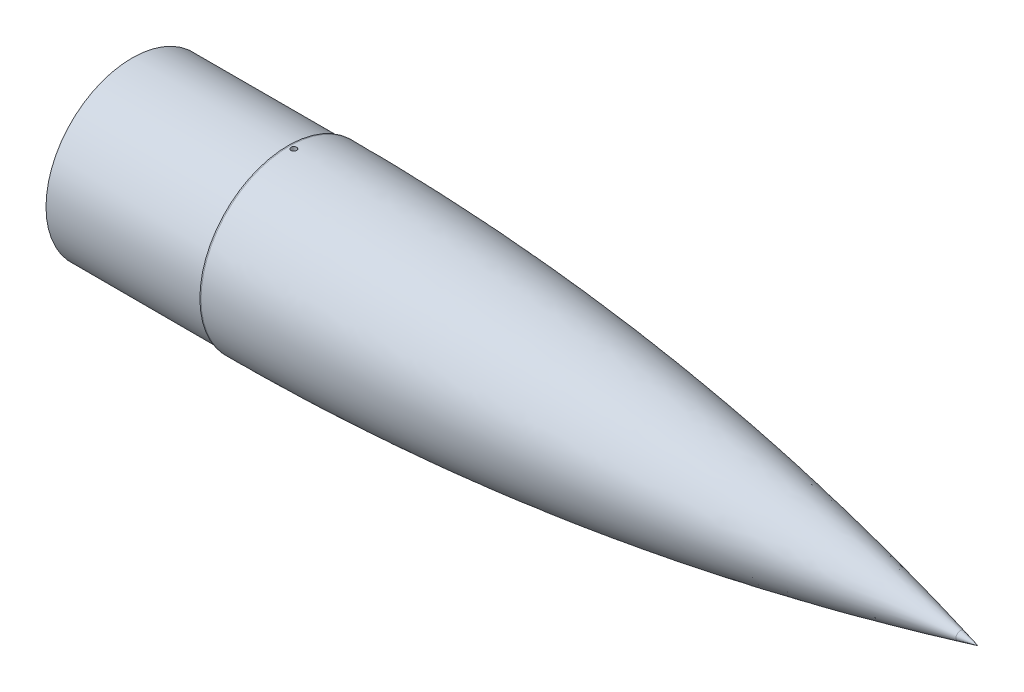
ISO-10303-21;
HEADER;
FILE_DESCRIPTION(('STEP AP214'),'2;1');
FILE_NAME('part.step','',(''),(''),'','','');
FILE_SCHEMA(('AUTOMOTIVE_DESIGN { 1 0 10303 214 1 1 1 1 }'));
ENDSEC;
DATA;
#1=APPLICATION_CONTEXT('core data for automotive mechanical design processes');
#2=APPLICATION_PROTOCOL_DEFINITION('international standard','automotive_design',2000,#1);
#3=PRODUCT_CONTEXT('',#1,'mechanical');
#4=PRODUCT('Part','Part','',(#3));
#5=PRODUCT_RELATED_PRODUCT_CATEGORY('part','',(#4));
#6=PRODUCT_DEFINITION_FORMATION('','',#4);
#7=PRODUCT_DEFINITION_CONTEXT('part definition',#1,'design');
#8=PRODUCT_DEFINITION('design','',#6,#7);
#9=PRODUCT_DEFINITION_SHAPE('','',#8);
#10=(LENGTH_UNIT() NAMED_UNIT(*) SI_UNIT(.MILLI.,.METRE.));
#11=(NAMED_UNIT(*) PLANE_ANGLE_UNIT() SI_UNIT($,.RADIAN.));
#12=(NAMED_UNIT(*) SI_UNIT($,.STERADIAN.) SOLID_ANGLE_UNIT());
#13=UNCERTAINTY_MEASURE_WITH_UNIT(LENGTH_MEASURE(1.E-05),#10,'distance_accuracy_value','');
#14=(GEOMETRIC_REPRESENTATION_CONTEXT(3) GLOBAL_UNCERTAINTY_ASSIGNED_CONTEXT((#13)) GLOBAL_UNIT_ASSIGNED_CONTEXT((#10,
#11,#12)) REPRESENTATION_CONTEXT('',''));
#15=CARTESIAN_POINT('',(0.,0.,0.));
#16=DIRECTION('',(0.,0.,1.));
#17=DIRECTION('',(1.,0.,0.));
#18=AXIS2_PLACEMENT_3D('',#15,#16,#17);
#19=CARTESIAN_POINT('',(-501.300996115071,74.,0.));
#20=DIRECTION('',(1.,0.,0.));
#21=DIRECTION('',(0.,0.,-1.));
#22=AXIS2_PLACEMENT_3D('',#19,#20,#21);
#23=PLANE('',#22);
#24=CARTESIAN_POINT('',(-501.300996115071,0.,0.));
#25=DIRECTION('',(-1.,0.,0.));
#26=DIRECTION('',(0.,0.,1.));
#27=AXIS2_PLACEMENT_3D('',#24,#25,#26);
#28=CIRCLE('',#27,78.);
#29=CARTESIAN_POINT('',(-501.300996115071,0.,78.));
#30=VERTEX_POINT('',#29);
#31=EDGE_CURVE('E121',#30,#30,#28,.T.);
#32=ORIENTED_EDGE('',*,*,#31,.T.);
#33=EDGE_LOOP('',(#32));
#34=FACE_BOUND('',#33,.T.);
#35=CARTESIAN_POINT('',(-501.300996115071,0.,0.));
#36=DIRECTION('',(1.,0.,0.));
#37=DIRECTION('',(0.,0.,-1.));
#38=AXIS2_PLACEMENT_3D('',#35,#36,#37);
#39=CIRCLE('',#38,76.);
#40=CARTESIAN_POINT('',(-501.300996115071,0.,-76.));
#41=VERTEX_POINT('',#40);
#42=EDGE_CURVE('E11',#41,#41,#39,.F.);
#43=ORIENTED_EDGE('',*,*,#42,.F.);
#44=EDGE_LOOP('',(#43));
#45=FACE_BOUND('',#44,.T.);
#46=ADVANCED_FACE('F38',(#34,#45),#23,.F.);
#47=CARTESIAN_POINT('',(108.299003884929,0.,0.));
#48=DIRECTION('',(-1.,0.,0.));
#49=DIRECTION('',(0.,0.,1.));
#50=AXIS2_PLACEMENT_3D('',#47,#48,#49);
#51=CONICAL_SURFACE('',#50,0.,0.244346095279238);
#52=CARTESIAN_POINT('',(92.7324294895745,0.,0.));
#53=DIRECTION('',(-1.,0.,0.));
#54=DIRECTION('',(0.,0.,1.));
#55=AXIS2_PLACEMENT_3D('',#52,#53,#54);
#56=CIRCLE('',#55,3.88118290510399);
#57=CARTESIAN_POINT('',(92.7324294895745,0.,3.88118290510399));
#58=VERTEX_POINT('',#57);
#59=EDGE_CURVE('E68',#58,#58,#56,.T.);
#60=ORIENTED_EDGE('',*,*,#59,.F.);
#61=EDGE_LOOP('',(#60));
#62=FACE_BOUND('',#61,.T.);
#63=CARTESIAN_POINT('',(108.299003884929,0.,0.));
#64=VERTEX_POINT('',#63);
#65=VERTEX_LOOP('',#64);
#66=FACE_BOUND('',#65,.T.);
#67=ADVANCED_FACE('F110',(#62,#66),#51,.T.);
#68=CARTESIAN_POINT('',(92.7324294895745,3.88118290510399,0.));
#69=CARTESIAN_POINT('',(86.5457645457053,5.4236917198188,0.));
#70=CARTESIAN_POINT('',(74.1524434091914,8.46569178392368,0.));
#71=CARTESIAN_POINT('',(49.3915074365341,14.3512714584433,0.));
#72=CARTESIAN_POINT('',(18.4398878969735,21.3483307194002,0.));
#73=CARTESIAN_POINT('',(-18.6874781693003,29.1651055267864,0.));
#74=CARTESIAN_POINT('',(-68.1765971395131,38.8158615895462,0.));
#75=CARTESIAN_POINT('',(-130.008955254166,49.4318538262277,0.));
#76=CARTESIAN_POINT('',(-228.880403388297,63.3295657030903,0.));
#77=CARTESIAN_POINT('',(-327.655384552638,72.595044210834,0.));
#78=CARTESIAN_POINT('',(-426.347775001488,77.2278570108382,0.));
#79=CARTESIAN_POINT('',(-475.642620813008,78.,0.));
#80=CARTESIAN_POINT('',(-500.300996115071,78.,0.));
#81=B_SPLINE_CURVE_WITH_KNOTS('',3,(#68,#69,#70,#71,#72,#73,#74,#75,#76,#77,#78,#79,#80),
.UNSPECIFIED.,.F.,.F.,(4,1,1,1,1,1,1,1,1,1,4),(0.,0.03125,0.0625,0.125,0.1875,0.25,0.375,0.5,
0.75,0.875,1.),.UNSPECIFIED.);
#82=CARTESIAN_POINT('',(-218.288054543994,0.,0.));
#83=DIRECTION('',(-1.,0.,0.));
#84=AXIS1_PLACEMENT('',#82,#83);
#85=SURFACE_OF_REVOLUTION('',#81,#84);
#86=CARTESIAN_POINT('',(-493.800996115071,77.9910571522512,0.));
#87=CARTESIAN_POINT('',(-493.801002328861,77.9910566408587,0.140394490492741));
#88=CARTESIAN_POINT('',(-493.812862169327,77.990706736512,0.280889917915189));
#89=CARTESIAN_POINT('',(-493.860007570093,77.989346187005,0.558009092811338));
#90=CARTESIAN_POINT('',(-493.895321095232,77.9883347530964,0.694628015147417));
#91=CARTESIAN_POINT('',(-493.988365727002,77.9857707523435,0.959939629598437));
#92=CARTESIAN_POINT('',(-494.046085884213,77.9842184498427,1.08863615760647));
#93=CARTESIAN_POINT('',(-494.182289760246,77.9807560386091,1.33447712100907));
#94=CARTESIAN_POINT('',(-494.260768412911,77.9788460172116,1.45162436546933));
#95=CARTESIAN_POINT('',(-494.436302684479,77.9748934909039,1.67112937905501));
#96=CARTESIAN_POINT('',(-494.533365254963,77.9728509366075,1.77348158866259));
#97=CARTESIAN_POINT('',(-494.743300191831,77.9688779472469,1.96044419849569));
#98=CARTESIAN_POINT('',(-494.856173184016,77.9669475166249,2.04505389611441));
#99=CARTESIAN_POINT('',(-495.094542189232,77.963432394991,2.1941360062647));
#100=CARTESIAN_POINT('',(-495.220039958157,77.9618477521697,2.25860561251523));
#101=CARTESIAN_POINT('',(-495.480083393446,77.9592213143315,2.36555861130341));
#102=CARTESIAN_POINT('',(-495.614629021458,77.9581795170139,2.40804209702597));
#103=CARTESIAN_POINT('',(-495.888901742077,77.9567758608757,2.4698039858805));
#104=CARTESIAN_POINT('',(-496.028627113272,77.9564137781917,2.48909002832194));
#105=CARTESIAN_POINT('',(-496.309332144434,77.9564297092069,2.5039337638773));
#106=CARTESIAN_POINT('',(-496.450311799472,77.956807719999,2.49949155019687));
#107=CARTESIAN_POINT('',(-496.729478388336,77.9582810670221,2.4670111953884));
#108=CARTESIAN_POINT('',(-496.86766616239,77.9593761840196,2.43898026504375));
#109=CARTESIAN_POINT('',(-497.137373062744,77.9621797324139,2.3601299785168));
#110=CARTESIAN_POINT('',(-497.268892171792,77.963888165397,2.3093105633876));
#111=CARTESIAN_POINT('',(-497.521561108786,77.9677449613928,2.18631377942682));
#112=CARTESIAN_POINT('',(-497.642708640935,77.9698934214523,2.11413169755027));
#113=CARTESIAN_POINT('',(-497.871169100998,77.9744052122747,1.95046210333895));
#114=CARTESIAN_POINT('',(-497.978481993207,77.9767685435922,1.85897454118448));
#115=CARTESIAN_POINT('',(-498.176275430622,77.9814602044646,1.65924368430209));
#116=CARTESIAN_POINT('',(-498.266748686273,77.9837885184623,1.55099317018934));
#117=CARTESIAN_POINT('',(-498.428238205312,77.9881595901882,1.3208345929981));
#118=CARTESIAN_POINT('',(-498.499254469251,77.9902023479246,1.19892653030692));
#119=CARTESIAN_POINT('',(-498.619810694924,77.9937821349648,0.944913974172142));
#120=CARTESIAN_POINT('',(-498.669351194398,77.9953191769313,0.812809736132623));
#121=CARTESIAN_POINT('',(-498.745548284586,77.9977213581512,0.542152925362374));
#122=CARTESIAN_POINT('',(-498.772204949047,77.9985864995699,0.403600373413972));
#123=CARTESIAN_POINT('',(-498.801867948306,77.9995508897233,0.124048982677422));
#124=CARTESIAN_POINT('',(-498.804885275507,77.9996504944357,-0.0169486885455879));
#125=CARTESIAN_POINT('',(-498.78721260022,77.999073957136,-0.297448585465822));
#126=CARTESIAN_POINT('',(-498.766522630565,77.9983978161982,-0.436950813233882));
#127=CARTESIAN_POINT('',(-498.702031578128,77.9963432553029,-0.710469994387665));
#128=CARTESIAN_POINT('',(-498.658235357665,77.9949649830992,-0.844488095423923));
#129=CARTESIAN_POINT('',(-498.548780061062,77.9916552088744,-1.10326995746871));
#130=CARTESIAN_POINT('',(-498.483120934377,77.9897237055742,-1.22803369708116));
#131=CARTESIAN_POINT('',(-498.3317761683,77.9855147829081,-1.46481470889308));
#132=CARTESIAN_POINT('',(-498.246083302741,77.9832372388293,-1.57682736004718));
#133=CARTESIAN_POINT('',(-498.057114338405,77.9785810421119,-1.78488031694734));
#134=CARTESIAN_POINT('',(-497.953838186618,77.9762023891684,-1.88092057453799));
#135=CARTESIAN_POINT('',(-497.732586196707,77.9715962924336,-2.05434031837994));
#136=CARTESIAN_POINT('',(-497.614604650251,77.969368907883,-2.13171252364819));
#137=CARTESIAN_POINT('',(-497.367320005021,77.9653007373398,-2.26555044913586));
#138=CARTESIAN_POINT('',(-497.238016930678,77.963459950513,-2.32201621446529));
#139=CARTESIAN_POINT('',(-496.97177995621,77.9603544927514,-2.41242822878951));
#140=CARTESIAN_POINT('',(-496.834847272864,77.9590897302451,-2.44637805757225));
#141=CARTESIAN_POINT('',(-496.557220965042,77.9572591183531,-2.49080534007034));
#142=CARTESIAN_POINT('',(-496.416527345025,77.9566932681384,-2.50128282162363));
#143=CARTESIAN_POINT('',(-496.135440149493,77.9563043651388,-2.49846692508232));
#144=CARTESIAN_POINT('',(-495.995046468152,77.9564809812129,-2.48518414561732));
#145=CARTESIAN_POINT('',(-495.718481973154,77.9575362750248,-2.43524592663514));
#146=CARTESIAN_POINT('',(-495.582311166609,77.9584149539451,-2.39859044775018));
#147=CARTESIAN_POINT('',(-495.318061392527,77.9607557648167,-2.30295084157771));
#148=CARTESIAN_POINT('',(-495.189982160045,77.962217877653,-2.24396744581959));
#149=CARTESIAN_POINT('',(-494.945546389749,77.9655423718682,-2.10534938715151));
#150=CARTESIAN_POINT('',(-494.829189428354,77.9674047387763,-2.0257154708133));
#151=CARTESIAN_POINT('',(-494.611458163384,77.9713039208939,-1.84802949748995));
#152=CARTESIAN_POINT('',(-494.510088174088,77.9733407860705,-1.74997215535289));
#153=CARTESIAN_POINT('',(-494.32522085844,77.9773450194367,-1.5382032792064));
#154=CARTESIAN_POINT('',(-494.241727963985,77.9793123702924,-1.42448787487155));
#155=CARTESIAN_POINT('',(-494.09496800533,77.9829446569032,-1.18458242477348));
#156=CARTESIAN_POINT('',(-494.03171472751,77.9846093861932,-1.05838395234426));
#157=CARTESIAN_POINT('',(-493.927366973872,77.9874359710828,-0.797251222211942));
#158=CARTESIAN_POINT('',(-493.886246095053,77.9885984255466,-0.662327589555051));
#159=CARTESIAN_POINT('',(-493.838222101957,77.9899729277046,-0.438793722007633));
#160=CARTESIAN_POINT('',(-493.824279926761,77.9903776739885,-0.351634012298617));
#161=CARTESIAN_POINT('',(-493.805664983103,77.9909199468327,-0.176329475937312));
#162=CARTESIAN_POINT('',(-493.800992212063,77.9910574734674,-0.0881846495591175));
#163=CARTESIAN_POINT('',(-493.800996115071,77.9910571522512,0.));
#164=B_SPLINE_CURVE_WITH_KNOTS('',3,(#86,#87,#88,#89,#90,#91,#92,#93,#94,#95,#96,#97,#98,#99,
#100,#101,#102,#103,#104,#105,#106,#107,#108,#109,#110,#111,#112,#113,#114,#115,#116,#117,#118,
#119,#120,#121,#122,#123,#124,#125,#126,#127,#128,#129,#130,#131,#132,#133,#134,#135,#136,#137,
#138,#139,#140,#141,#142,#143,#144,#145,#146,#147,#148,#149,#150,#151,#152,#153,#154,#155,#156,
#157,#158,#159,#160,#161,#162,#163),.UNSPECIFIED.,.T.,.F.,(4,2,2,2,2,2,2,2,2,2,2,2,2,2,2,2,2,2,
2,2,2,2,2,2,2,2,2,2,2,2,2,2,2,2,2,2,2,2,4),(0.,0.420861596467131,0.842225907389443,
1.26338456940113,1.68444054138282,2.10565432418643,2.52688478398569,2.94817391106342,
3.36946125255546,3.79060981899974,4.21175673115483,4.63277495057357,5.05379425904537,
5.47490652239175,5.89601987247334,6.31731509256797,6.73861030071501,7.15989495925777,
7.58117826013249,8.00226565065598,8.42335245799774,8.84435069006786,9.26534989545546,
9.68650119015615,10.1076537545693,10.5289703139002,10.9502859641473,11.3715346137402,
11.7927827637365,12.2138430563757,12.6349040582294,13.0559512660583,13.4769832540224,
13.8981362089042,14.3193934509455,14.740937027957,15.1619766006695,15.4263284466222,
15.690680219025),.UNSPECIFIED.);
#165=CARTESIAN_POINT('',(-493.800996115071,77.9910571522512,0.));
#166=VERTEX_POINT('',#165);
#167=EDGE_CURVE('E100',#166,#166,#164,.T.);
#168=ORIENTED_EDGE('',*,*,#167,.T.);
#169=EDGE_LOOP('',(#168));
#170=FACE_BOUND('',#169,.T.);
#171=CARTESIAN_POINT('',(-496.300996115071,-77.9565373120493,2.50000000000002));
#172=CARTESIAN_POINT('',(-496.160610679899,-77.9562999962143,2.49999378631489));
#173=CARTESIAN_POINT('',(-496.02012371131,-77.9564320927983,2.48813546947853));
#174=CARTESIAN_POINT('',(-495.743020071647,-77.9574034598805,2.44099562649712));
#175=CARTESIAN_POINT('',(-495.606408221555,-77.9582435744829,2.40568615237176));
#176=CARTESIAN_POINT('',(-495.341109333608,-77.9605163771295,2.31265185620578));
#177=CARTESIAN_POINT('',(-495.212418460421,-77.9619487757554,2.25493798286585));
#178=CARTESIAN_POINT('',(-494.966587273257,-77.9652259697378,2.11874884148595));
#179=CARTESIAN_POINT('',(-494.84944415336,-77.9670706645552,2.04027863405583));
#180=CARTESIAN_POINT('',(-494.629944340237,-77.970948807072,1.86476245492168));
#181=CARTESIAN_POINT('',(-494.527593363599,-77.9729823272492,1.76770933514975));
#182=CARTESIAN_POINT('',(-494.340631040183,-77.9769938284834,1.55779480992268));
#183=CARTESIAN_POINT('',(-494.256020401521,-77.9789718073207,1.4449327737448));
#184=CARTESIAN_POINT('',(-494.106928923915,-77.9826375403881,1.20657910682091));
#185=CARTESIAN_POINT('',(-494.042452141123,-77.9843252361072,1.08108493793875));
#186=CARTESIAN_POINT('',(-493.935484264078,-77.9872104246213,0.821047478015244));
#187=CARTESIAN_POINT('',(-493.892993084897,-77.9884079193099,0.686504221931057));
#188=CARTESIAN_POINT('',(-493.831213824758,-77.9901713597319,0.412227032174523));
#189=CARTESIAN_POINT('',(-493.8119193363,-77.9907374798634,0.272494542895894));
#190=CARTESIAN_POINT('',(-493.797061504077,-77.9911721871251,-0.00822713727420053));
#191=CARTESIAN_POINT('',(-493.801498067428,-77.9910407769854,-0.149216323244757));
#192=CARTESIAN_POINT('',(-493.833970634721,-77.9900960297901,-0.428402969858885));
#193=CARTESIAN_POINT('',(-493.861999265087,-77.9892829058008,-0.566601288955602));
#194=CARTESIAN_POINT('',(-493.940848976438,-77.9870706152723,-0.836330276199506));
#195=CARTESIAN_POINT('',(-493.99167010818,-77.9856714474281,-0.967860929498028));
#196=CARTESIAN_POINT('',(-494.114670807307,-77.9824516461889,-1.22054471332572));
#197=CARTESIAN_POINT('',(-494.186853772044,-77.9806309457641,-1.34169618921223));
#198=CARTESIAN_POINT('',(-494.350526743792,-77.9767835779744,-1.57016431773625));
#199=CARTESIAN_POINT('',(-494.442016793146,-77.974756910158,-1.67748094003158));
#200=CARTESIAN_POINT('',(-494.641747849408,-77.9707381875436,-1.875274982438));
#201=CARTESIAN_POINT('',(-494.749995111279,-77.9687461459808,-1.96574608673331));
#202=CARTESIAN_POINT('',(-494.98014580828,-77.9650375263622,-2.12723205270238));
#203=CARTESIAN_POINT('',(-495.102049242324,-77.9633209482845,-2.19824691592438));
#204=CARTESIAN_POINT('',(-495.356050988337,-77.9603743615587,-2.31880157779053));
#205=CARTESIAN_POINT('',(-495.488149062278,-77.9591443415543,-2.36834187765353));
#206=CARTESIAN_POINT('',(-495.758791828186,-77.9573285448425,-2.44454040501641));
#207=CARTESIAN_POINT('',(-495.897336501548,-77.9567427662758,-2.4711986985528));
#208=CARTESIAN_POINT('',(-496.176879395919,-77.9563014939276,-2.50086849184933));
#209=CARTESIAN_POINT('',(-496.317876600379,-77.9564457044374,-2.50388956546509));
#210=CARTESIAN_POINT('',(-496.59837517945,-77.9574675855149,-2.48622475541285));
#211=CARTESIAN_POINT('',(-496.737876555502,-77.9583452553758,-2.46553889458468));
#212=CARTESIAN_POINT('',(-497.01140309322,-77.9607547552968,-2.40105453198894));
#213=CARTESIAN_POINT('',(-497.145429056378,-77.9622864892361,-2.35725942611294));
#214=CARTESIAN_POINT('',(-497.404226343045,-77.9658505267668,-2.2478038936504));
#215=CARTESIAN_POINT('',(-497.528997644094,-77.967882831573,-2.18214341400042));
#216=CARTESIAN_POINT('',(-497.765794229394,-77.9722376349297,-2.03079262675475));
#217=CARTESIAN_POINT('',(-497.877814787746,-77.9745602404118,-1.94509492832906));
#218=CARTESIAN_POINT('',(-498.085882094521,-77.9792493190104,-1.75611323008236));
#219=CARTESIAN_POINT('',(-498.18192879974,-77.9816157922455,-1.65282918269734));
#220=CARTESIAN_POINT('',(-498.355354132548,-77.9861404747099,-1.43156493799025));
#221=CARTESIAN_POINT('',(-498.432726531581,-77.9882986143088,-1.31357985718209));
#222=CARTESIAN_POINT('',(-498.566563895807,-77.9921734869763,-1.06628748460502));
#223=CARTESIAN_POINT('',(-498.623028915397,-77.9938902211934,-0.936980222296153));
#224=CARTESIAN_POINT('',(-498.713434999962,-77.9966964512314,-0.670744213957628));
#225=CARTESIAN_POINT('',(-498.747381196083,-77.997786089935,-0.533817211876906));
#226=CARTESIAN_POINT('',(-498.791803256338,-77.9992207198349,-0.256203648780047));
#227=CARTESIAN_POINT('',(-498.802279152088,-77.9995657120342,-0.115517092828595));
#228=CARTESIAN_POINT('',(-498.799462721041,-77.9994736646186,0.165552196601192));
#229=CARTESIAN_POINT('',(-498.786181399903,-77.9990369871162,0.305935040614003));
#230=CARTESIAN_POINT('',(-498.736250201419,-77.9974296156442,0.582477247992559));
#231=CARTESIAN_POINT('',(-498.699600278817,-77.996258920253,0.71863660317838));
#232=CARTESIAN_POINT('',(-498.603973951604,-77.9933101330293,0.982870580078285));
#233=CARTESIAN_POINT('',(-498.544997185682,-77.9915320313672,1.11094507091734));
#234=CARTESIAN_POINT('',(-498.406394815071,-77.9875603261209,1.35537235298761));
#235=CARTESIAN_POINT('',(-498.326769947756,-77.985366737375,1.4717255625977));
#236=CARTESIAN_POINT('',(-498.149097832153,-77.9807987740923,1.68945906158308));
#237=CARTESIAN_POINT('',(-498.051044030473,-77.9784243354239,1.79083400165906));
#238=CARTESIAN_POINT('',(-497.839281061623,-77.9737482678429,1.9757117618535));
#239=CARTESIAN_POINT('',(-497.725568020545,-77.9714466571208,2.05921014642786));
#240=CARTESIAN_POINT('',(-497.485662244018,-77.9671585952299,2.20598350709105));
#241=CARTESIAN_POINT('',(-497.359460756964,-77.9651723676494,2.26924416776576));
#242=CARTESIAN_POINT('',(-497.098319149457,-77.9617254733111,2.37360540763143));
#243=CARTESIAN_POINT('',(-496.963389659879,-77.9602641808842,2.4147323972343));
#244=CARTESIAN_POINT('',(-496.739839829866,-77.9584288003313,2.46276544396502));
#245=CARTESIAN_POINT('',(-496.652670719707,-77.9578524917152,2.47671078203984));
#246=CARTESIAN_POINT('',(-496.47734646896,-77.956981292815,2.49533001054989));
#247=CARTESIAN_POINT('',(-496.389191328657,-77.9566864024498,2.50000390366201));
#248=CARTESIAN_POINT('',(-496.300996115071,-77.9565373120493,2.50000000000002));
#249=B_SPLINE_CURVE_WITH_KNOTS('',3,(#171,#172,#173,#174,#175,#176,#177,#178,#179,#180,#181,
#182,#183,#184,#185,#186,#187,#188,#189,#190,#191,#192,#193,#194,#195,#196,#197,#198,#199,#200,
#201,#202,#203,#204,#205,#206,#207,#208,#209,#210,#211,#212,#213,#214,#215,#216,#217,#218,#219,
#220,#221,#222,#223,#224,#225,#226,#227,#228,#229,#230,#231,#232,#233,#234,#235,#236,#237,#238,
#239,#240,#241,#242,#243,#244,#245,#246,#247,#248),.UNSPECIFIED.,.T.,.F.,(4,2,2,2,2,2,2,2,2,2,2,
2,2,2,2,2,2,2,2,2,2,2,2,2,2,2,2,2,2,2,2,2,2,2,2,2,2,2,4),(0.,0.420834999089409,
0.842172431528862,1.26330422123194,1.68433342911994,2.10552491584926,2.52673321149496,
2.94802630882548,3.3693177787691,3.79049285082135,4.21166627438197,4.63270811124232,
5.05375088570732,5.47486065815479,5.89597135415176,6.31723961880101,6.73850784992769,
7.15976624807452,7.58102343048335,8.0021099809674,8.42319612576705,8.84422040940146,
9.26524571479553,9.68642656319053,10.1076085507286,10.5289308241531,10.9502520013392,
11.3714771431485,11.7927017175329,12.2137312078755,12.6347615136042,13.0557986330809,
13.4768207187486,13.8979928055484,14.3192692730761,14.7408430803798,15.1619127343788,
15.4262965951388,15.6906803795644),.UNSPECIFIED.);
#250=CARTESIAN_POINT('',(-496.300996115071,-77.9565373120493,2.50000000000002));
#251=VERTEX_POINT('',#250);
#252=EDGE_CURVE('E95',#251,#251,#249,.T.);
#253=ORIENTED_EDGE('',*,*,#252,.T.);
#254=EDGE_LOOP('',(#253));
#255=FACE_BOUND('',#254,.T.);
#256=CARTESIAN_POINT('',(-500.300996115071,0.,0.));
#257=DIRECTION('',(-1.,0.,0.));
#258=DIRECTION('',(0.,0.,1.));
#259=AXIS2_PLACEMENT_3D('',#256,#257,#258);
#260=CIRCLE('',#259,78.);
#261=CARTESIAN_POINT('',(-500.300996115071,0.,78.));
#262=VERTEX_POINT('',#261);
#263=EDGE_CURVE('E72',#262,#262,#260,.T.);
#264=ORIENTED_EDGE('',*,*,#263,.F.);
#265=EDGE_LOOP('',(#264));
#266=FACE_BOUND('',#265,.T.);
#267=ORIENTED_EDGE('',*,*,#59,.T.);
#268=EDGE_LOOP('',(#267));
#269=FACE_BOUND('',#268,.T.);
#270=ADVANCED_FACE('F104',(#170,#255,#266,#269),#85,.T.);
#271=CARTESIAN_POINT('',(-218.288054543994,0.,0.));
#272=DIRECTION('',(-1.,0.,0.));
#273=DIRECTION('',(0.,0.,1.));
#274=AXIS2_PLACEMENT_3D('',#271,#272,#273);
#275=CYLINDRICAL_SURFACE('',#274,78.);
#276=ORIENTED_EDGE('',*,*,#31,.F.);
#277=EDGE_LOOP('',(#276));
#278=FACE_BOUND('',#277,.T.);
#279=ORIENTED_EDGE('',*,*,#263,.T.);
#280=EDGE_LOOP('',(#279));
#281=FACE_BOUND('',#280,.T.);
#282=ADVANCED_FACE('F109',(#278,#281),#275,.T.);
#283=CARTESIAN_POINT('',(-639.300996115071,0.,0.));
#284=DIRECTION('',(-1.,0.,0.));
#285=DIRECTION('',(0.,0.,1.));
#286=AXIS2_PLACEMENT_3D('',#283,#284,#285);
#287=PLANE('',#286);
#288=CARTESIAN_POINT('',(-639.300996115071,0.,0.));
#289=DIRECTION('',(-1.,0.,0.));
#290=DIRECTION('',(0.,0.,1.));
#291=AXIS2_PLACEMENT_3D('',#288,#289,#290);
#292=CIRCLE('',#291,76.);
#293=CARTESIAN_POINT('',(-639.300996115071,0.,76.));
#294=VERTEX_POINT('',#293);
#295=EDGE_CURVE('E127',#294,#294,#292,.T.);
#296=ORIENTED_EDGE('',*,*,#295,.T.);
#297=EDGE_LOOP('',(#296));
#298=FACE_BOUND('',#297,.T.);
#299=CARTESIAN_POINT('',(-639.300996115071,0.,0.));
#300=DIRECTION('',(-1.,0.,0.));
#301=DIRECTION('',(0.,0.,1.));
#302=AXIS2_PLACEMENT_3D('',#299,#300,#301);
#303=CIRCLE('',#302,74.);
#304=CARTESIAN_POINT('',(-639.300996115071,0.,74.));
#305=VERTEX_POINT('',#304);
#306=EDGE_CURVE('E156',#305,#305,#303,.T.);
#307=ORIENTED_EDGE('',*,*,#306,.F.);
#308=EDGE_LOOP('',(#307));
#309=FACE_BOUND('',#308,.T.);
#310=ADVANCED_FACE('F88',(#298,#309),#287,.T.);
#311=CARTESIAN_POINT('',(-639.300996115071,0.,0.));
#312=DIRECTION('',(1.,0.,0.));
#313=DIRECTION('',(0.,0.,-1.));
#314=AXIS2_PLACEMENT_3D('',#311,#312,#313);
#315=CYLINDRICAL_SURFACE('',#314,76.);
#316=ORIENTED_EDGE('',*,*,#295,.F.);
#317=EDGE_LOOP('',(#316));
#318=FACE_BOUND('',#317,.T.);
#319=ORIENTED_EDGE('',*,*,#42,.T.);
#320=EDGE_LOOP('',(#319));
#321=FACE_BOUND('',#320,.T.);
#322=ADVANCED_FACE('F62',(#318,#321),#315,.T.);
#323=CARTESIAN_POINT('',(-500.300996115071,74.,0.));
#324=CARTESIAN_POINT('',(-205.033047174479,74.,0.));
#325=CARTESIAN_POINT('',(91.7647419071758,0.,0.));
#326=B_SPLINE_CURVE_WITH_KNOTS('',2,(#323,#324,#325),.UNSPECIFIED.,.F.,.F.,(3,3),(0.,1.),.UNSPECIFIED.);
#327=CARTESIAN_POINT('',(-218.288054543994,0.,0.));
#328=DIRECTION('',(-1.,0.,0.));
#329=AXIS1_PLACEMENT('',#327,#328);
#330=SURFACE_OF_REVOLUTION('',#326,#329);
#331=CARTESIAN_POINT('',(-498.800996115071,73.9995225631716,0.));
#332=CARTESIAN_POINT('',(-498.800989900991,73.9995220020228,0.140380650442031));
#333=CARTESIAN_POINT('',(-498.789132375526,73.9991113558445,0.280862137327947));
#334=CARTESIAN_POINT('',(-498.741996576036,73.9975110279589,0.557953253686365));
#335=CARTESIAN_POINT('',(-498.706690368062,73.9963204171183,0.694558062317571));
#336=CARTESIAN_POINT('',(-498.613666235207,73.9932899017684,0.95984142265998));
#337=CARTESIAN_POINT('',(-498.555959358746,73.9914503173855,1.08852384564236));
#338=CARTESIAN_POINT('',(-498.419788169343,73.9873210560874,1.33433904631828));
#339=CARTESIAN_POINT('',(-498.341328901195,73.9850314885955,1.45147462150134));
#340=CARTESIAN_POINT('',(-498.165830354092,73.9802473825079,1.67097161648017));
#341=CARTESIAN_POINT('',(-498.068782332352,73.9777527477802,1.77332604442034));
#342=CARTESIAN_POINT('',(-497.858877201529,73.9728264984804,1.96029645724013));
#343=CARTESIAN_POINT('',(-497.746019456907,73.9703948864465,2.04491172867765));
#344=CARTESIAN_POINT('',(-497.507665826445,73.9658521301735,2.19401784761183));
#345=CARTESIAN_POINT('',(-497.382166724186,73.9637410678381,2.2585035562247));
#346=CARTESIAN_POINT('',(-497.122115507911,73.9600604172095,2.3654874416545));
#347=CARTESIAN_POINT('',(-496.987563432782,73.9584908265906,2.40798571291201));
#348=CARTESIAN_POINT('',(-496.713275574093,73.9560515151215,2.469773584525));
#349=CARTESIAN_POINT('',(-496.573541633087,73.9551815479505,2.48907135441035));
#350=CARTESIAN_POINT('',(-496.292814979493,73.954218784857,2.50393490167432));
#351=CARTESIAN_POINT('',(-496.151822272731,73.9541259853392,2.49950078883809));
#352=CARTESIAN_POINT('',(-495.872643120079,73.954707705853,2.46703349128158));
#353=CARTESIAN_POINT('',(-495.734455513302,73.9553819015916,2.43901028156245));
#354=CARTESIAN_POINT('',(-495.464746425972,73.9574012399577,2.36017500344647));
#355=CARTESIAN_POINT('',(-495.333224959462,73.9587463839985,2.30936288704851));
#356=CARTESIAN_POINT('',(-495.080559545339,73.961937359191,2.18638476503122));
#357=CARTESIAN_POINT('',(-494.959417097429,73.9637832625393,2.11421568015219));
#358=CARTESIAN_POINT('',(-494.730963698794,73.96775029404,1.95057445685006));
#359=CARTESIAN_POINT('',(-494.623652785044,73.9698714229282,1.8591022668261));
#360=CARTESIAN_POINT('',(-494.425857453658,73.9741356042956,1.65940191883531));
#361=CARTESIAN_POINT('',(-494.335380723005,73.9762786663212,1.5511661472584));
#362=CARTESIAN_POINT('',(-494.173880967485,73.9803312677872,1.3210380115365));
#363=CARTESIAN_POINT('',(-494.102857949377,73.9822408071464,1.19914564264612));
#364=CARTESIAN_POINT('',(-493.982280023333,73.9856010468513,0.945155552882979));
#365=CARTESIAN_POINT('',(-493.93272611191,73.9870517258977,0.813057358629735));
#366=CARTESIAN_POINT('',(-493.856501259405,73.9893234551911,0.542410978748897));
#367=CARTESIAN_POINT('',(-493.829830251494,73.990144507277,0.403862811959145));
#368=CARTESIAN_POINT('',(-493.800136974938,73.9910603810114,0.124310801381682));
#369=CARTESIAN_POINT('',(-493.797104924488,73.9911555030497,-0.0166920024663203));
#370=CARTESIAN_POINT('',(-493.814750141113,73.9906091568098,-0.297204603211614));
#371=CARTESIAN_POINT('',(-493.835427378858,73.9899676894428,-0.436714401955733));
#372=CARTESIAN_POINT('',(-493.899895927783,73.9880236117796,-0.710252724752801));
#373=CARTESIAN_POINT('',(-493.943682666324,73.9867211322787,-0.844282327512447));
#374=CARTESIAN_POINT('',(-494.053122727689,73.9836080523143,-1.10308877331517));
#375=CARTESIAN_POINT('',(-494.118776099968,73.9817974507016,-1.2278655954311));
#376=CARTESIAN_POINT('',(-494.270111731391,73.9778807082535,-1.46467063036018));
#377=CARTESIAN_POINT('',(-494.355800739433,73.9757744679294,-1.57669452847076));
#378=CARTESIAN_POINT('',(-494.544765484305,73.9715164422795,-1.78477025925344));
#379=CARTESIAN_POINT('',(-494.648041267726,73.969364656833,-1.88082204961155));
#380=CARTESIAN_POINT('',(-494.869288889796,73.9652721110576,-2.05425862297837));
#381=CARTESIAN_POINT('',(-494.987265534918,73.9633314201368,-2.13163727636089));
#382=CARTESIAN_POINT('',(-495.234541375073,73.9598977137735,-2.26548881254457));
#383=CARTESIAN_POINT('',(-495.363840539957,73.9584046971391,-2.32196175101019));
#384=CARTESIAN_POINT('',(-495.630061105615,73.9560536718514,-2.41238558234328));
#385=CARTESIAN_POINT('',(-495.766980786623,73.955195520544,-2.44634153459407));
#386=CARTESIAN_POINT('',(-496.044580150197,73.9542301896186,-2.49078499513304));
#387=CARTESIAN_POINT('',(-496.185259828039,73.9541230090569,-2.50127253290757));
#388=CARTESIAN_POINT('',(-496.466319296236,73.954691748473,-2.49848157541519));
#389=CARTESIAN_POINT('',(-496.606699191475,73.9553673231546,-2.48521355800916));
#390=CARTESIAN_POINT('',(-496.883236863057,73.957444860611,-2.43531037392435));
#391=CARTESIAN_POINT('',(-497.019394629679,73.9588468250579,-2.39867515345537));
#392=CARTESIAN_POINT('',(-497.283634556347,73.9622386187969,-2.30307699599213));
#393=CARTESIAN_POINT('',(-497.411716165053,73.9642284881713,-2.24411253655647));
#394=CARTESIAN_POINT('',(-497.656159539343,73.9685900046323,-2.10553327562697));
#395=CARTESIAN_POINT('',(-497.772521719109,73.9709616382192,-2.02591920427238));
#396=CARTESIAN_POINT('',(-497.990278801407,73.9758372190259,-1.84826341342889));
#397=CARTESIAN_POINT('',(-498.091667856197,73.9783412174249,-1.75021452804057));
#398=CARTESIAN_POINT('',(-498.276574162735,73.9832136728684,-1.53845732060506));
#399=CARTESIAN_POINT('',(-498.360086987797,73.9855820962344,-1.42474513128924));
#400=CARTESIAN_POINT('',(-498.506884891388,73.9899292125991,-1.18484269312865));
#401=CARTESIAN_POINT('',(-498.570156642558,73.9919076484901,-1.05864429426298));
#402=CARTESIAN_POINT('',(-498.674540212397,73.9952564299797,-0.79750598143468));
#403=CARTESIAN_POINT('',(-498.715678437727,73.9966274998567,-0.662576700327857));
#404=CARTESIAN_POINT('',(-498.763735383495,73.9982470228396,-0.438996887306647));
#405=CARTESIAN_POINT('',(-498.777690543296,73.9987233454766,-0.351797564633012));
#406=CARTESIAN_POINT('',(-498.796322859974,73.9993612919156,-0.176412103941265));
#407=CARTESIAN_POINT('',(-498.801000020476,73.9995229158405,-0.0882259663085631));
#408=CARTESIAN_POINT('',(-498.800996115071,73.9995225631716,0.));
#409=B_SPLINE_CURVE_WITH_KNOTS('',3,(#331,#332,#333,#334,#335,#336,#337,#338,#339,#340,#341,
#342,#343,#344,#345,#346,#347,#348,#349,#350,#351,#352,#353,#354,#355,#356,#357,#358,#359,#360,
#361,#362,#363,#364,#365,#366,#367,#368,#369,#370,#371,#372,#373,#374,#375,#376,#377,#378,#379,
#380,#381,#382,#383,#384,#385,#386,#387,#388,#389,#390,#391,#392,#393,#394,#395,#396,#397,#398,
#399,#400,#401,#402,#403,#404,#405,#406,#407,#408),.UNSPECIFIED.,.T.,.F.,(4,2,2,2,2,2,2,2,2,2,2,
2,2,2,2,2,2,2,2,2,2,2,2,2,2,2,2,2,2,2,2,2,2,2,2,2,2,2,4),(0.,0.42081990034602,0.842142016405977,
1.2632565921751,1.68426889120185,2.10547969188902,2.5267074297901,2.94804261530128,
3.3693759910757,3.7905609603713,4.211743981241,4.63274898801231,5.05375488156604,
5.47482150558453,5.8958892552083,6.31714880738851,6.73840850594815,7.15968775569259,
7.58096577512266,8.00206946038195,8.42317262468164,8.84419249719207,9.26521332190018,
9.68637617007654,10.1075401339979,10.5288421613165,10.9501430668501,11.371349277399,
11.7925549587328,12.2135749046739,12.6345958197866,13.0556454459141,13.4766801863883,
13.8978789292648,14.319181853109,14.7407616078145,15.161837270258,15.42631287094,
15.6907883683322),.UNSPECIFIED.);
#410=CARTESIAN_POINT('',(-498.800996115071,73.9995225631716,0.));
#411=VERTEX_POINT('',#410);
#412=EDGE_CURVE('E41',#411,#411,#409,.T.);
#413=ORIENTED_EDGE('',*,*,#412,.T.);
#414=EDGE_LOOP('',(#413));
#415=FACE_BOUND('',#414,.T.);
#416=CARTESIAN_POINT('',(-496.300996115071,-73.9543612426578,2.50000000000002));
#417=CARTESIAN_POINT('',(-496.441386921562,-73.9546002421829,2.49999378583987));
#418=CARTESIAN_POINT('',(-496.581877933328,-73.9552296802361,2.48813455200694));
#419=CARTESIAN_POINT('',(-496.858986626934,-73.9572217096485,2.44099247947601));
#420=CARTESIAN_POINT('',(-496.995599483495,-73.9585851755363,2.40568168859839));
#421=CARTESIAN_POINT('',(-497.260897421465,-73.9619100276697,2.31264580051215));
#422=CARTESIAN_POINT('',(-497.389586374184,-73.9638711191076,2.25493175096116));
#423=CARTESIAN_POINT('',(-497.635412947539,-73.9681883156049,2.11874366380232));
#424=CARTESIAN_POINT('',(-497.752553369075,-73.9705443245076,2.04027467703901));
#425=CARTESIAN_POINT('',(-497.97205649593,-73.9754041520325,1.86475529846459));
#426=CARTESIAN_POINT('',(-498.074412402862,-73.9779080379124,1.76769640584118));
#427=CARTESIAN_POINT('',(-498.261383302289,-73.98279524363,1.55776771365773));
#428=CARTESIAN_POINT('',(-498.345997587835,-73.9851785586605,1.44489728435602));
#429=CARTESIAN_POINT('',(-498.495093088212,-73.9895684722414,1.20652579891896));
#430=CARTESIAN_POINT('',(-498.55957061099,-73.9915750016817,1.08102243212018));
#431=CARTESIAN_POINT('',(-498.666537497482,-73.9949937899725,0.820963988385495));
#432=CARTESIAN_POINT('',(-498.709026964926,-73.9964060516265,0.686408954154497));
#433=CARTESIAN_POINT('',(-498.770794861374,-73.9984826813963,0.412125721786398));
#434=CARTESIAN_POINT('',(-498.790082887164,-73.9991473587272,0.272399687192357));
#435=CARTESIAN_POINT('',(-498.804930055533,-73.9996576956987,-0.00830848322773314));
#436=CARTESIAN_POINT('',(-498.800489308498,-73.9995033591494,-0.149290613207349));
#437=CARTESIAN_POINT('',(-498.768012658865,-73.9983926786604,-0.428447245541076));
#438=CARTESIAN_POINT('',(-498.739986592116,-73.9974366690452,-0.566622893693002));
#439=CARTESIAN_POINT('',(-498.661150136533,-73.9948267535518,-0.836306927237937));
#440=CARTESIAN_POINT('',(-498.610339691282,-73.9931728459455,-0.967815296120756));
#441=CARTESIAN_POINT('',(-498.487365712055,-73.9893456775051,-1.22046326596109));
#442=CARTESIAN_POINT('',(-498.415197695311,-73.9871723076588,-1.34160068325682));
#443=CARTESIAN_POINT('',(-498.251560659781,-73.9825407845471,-1.57004427268673));
#444=CARTESIAN_POINT('',(-498.160091581066,-73.9800826303975,-1.67735040187341));
#445=CARTESIAN_POINT('',(-497.960392391911,-73.97514391725,-1.87514391351468));
#446=CARTESIAN_POINT('',(-497.852153584693,-73.9726633472593,-1.96562251534043));
#447=CARTESIAN_POINT('',(-497.622018161357,-73.9679452007892,-2.12712531813298));
#448=CARTESIAN_POINT('',(-497.500121539225,-73.9657076244167,-2.19814951053541));
#449=CARTESIAN_POINT('',(-497.246120651742,-73.961710295047,-2.31872906936283));
#450=CARTESIAN_POINT('',(-497.114015864237,-73.9599505665128,-2.36828333672959));
#451=CARTESIAN_POINT('',(-496.84335451948,-73.9570888295632,-2.44450692057595));
#452=CARTESIAN_POINT('',(-496.704797983267,-73.9559868190033,-2.47117631166893));
#453=CARTESIAN_POINT('',(-496.425236371773,-73.954545486268,-2.50086265828374));
#454=CARTESIAN_POINT('',(-496.284232486586,-73.9542058033114,-2.5038908040084));
#455=CARTESIAN_POINT('',(-496.003717312912,-73.9543062174418,-2.48623718550801));
#456=CARTESIAN_POINT('',(-495.864206021932,-73.9547463132265,-2.465555460884));
#457=CARTESIAN_POINT('',(-495.590674231656,-73.956336409601,-2.40107932247194));
#458=CARTESIAN_POINT('',(-495.456652290727,-73.9574862225109,-2.35729101950442));
#459=CARTESIAN_POINT('',(-495.197860898809,-73.9603467379,-2.24785017120787));
#460=CARTESIAN_POINT('',(-495.073091467647,-73.9620574415811,-2.18219757902868));
#461=CARTESIAN_POINT('',(-494.836301952504,-73.9658297231214,-2.03086682239608));
#462=CARTESIAN_POINT('',(-494.724286055102,-73.9678914156482,-1.9451821100584));
#463=CARTESIAN_POINT('',(-494.516224920792,-73.9721169228633,-1.75622894214016));
#464=CARTESIAN_POINT('',(-494.420179730905,-73.9742807378522,-1.65296043479064));
#465=CARTESIAN_POINT('',(-494.246749320392,-73.9784537945783,-1.43172395446352));
#466=CARTESIAN_POINT('',(-494.169371246509,-73.9804629769142,-1.31375037775451));
#467=CARTESIAN_POINT('',(-494.035519991838,-73.9840882767748,-1.06648130591596));
#468=CARTESIAN_POINT('',(-493.979046764547,-73.9857043951739,-0.93718583597311));
#469=CARTESIAN_POINT('',(-493.888618121748,-73.9883530612459,-0.670963597945529));
#470=CARTESIAN_POINT('',(-493.854659149184,-73.9893857010996,-0.534038039055945));
#471=CARTESIAN_POINT('',(-493.810211723574,-73.9907465107228,-0.256425560645163));
#472=CARTESIAN_POINT('',(-493.799723244753,-73.9910746812661,-0.115738645254814));
#473=CARTESIAN_POINT('',(-493.802515008861,-73.9909880661203,0.165338823623685));
#474=CARTESIAN_POINT('',(-493.815785145141,-73.990573596342,0.30572947770493));
#475=CARTESIAN_POINT('',(-493.865696664363,-73.9890509176069,0.582289216009016));
#476=CARTESIAN_POINT('',(-493.902338094551,-73.9879427072476,0.718458291697401));
#477=CARTESIAN_POINT('',(-493.997950677673,-73.9851626045092,0.982713243982276));
#478=CARTESIAN_POINT('',(-494.056922196126,-73.9834907029032,1.11079898822406));
#479=CARTESIAN_POINT('',(-494.195517810412,-73.9797800153495,1.35524956242892));
#480=CARTESIAN_POINT('',(-494.275141166582,-73.9777412425424,1.47161481196431));
#481=CARTESIAN_POINT('',(-494.452810890985,-73.9735370253974,1.68936806428373));
#482=CARTESIAN_POINT('',(-494.55086312825,-73.9713715408574,1.79075127732632));
#483=CARTESIAN_POINT('',(-494.762625500581,-73.9671720141579,1.97564541763064));
#484=CARTESIAN_POINT('',(-494.876339499625,-73.9651380046175,2.05915192142802));
#485=CARTESIAN_POINT('',(-495.116240687962,-73.9614464446007,2.20593527713564));
#486=CARTESIAN_POINT('',(-495.242435759798,-73.9597891342392,2.26919923648351));
#487=CARTESIAN_POINT('',(-495.503564313992,-73.9570599087004,2.37356860120835));
#488=CARTESIAN_POINT('',(-495.638487170076,-73.9559872961068,2.41470040463361));
#489=CARTESIAN_POINT('',(-495.862050221521,-73.9548284587462,2.46274801360245));
#490=CARTESIAN_POINT('',(-495.949239976926,-73.9545237425821,2.4766999478551));
#491=CARTESIAN_POINT('',(-496.124605338837,-73.9542150464023,2.49532789165178));
#492=CARTESIAN_POINT('',(-496.212780944972,-73.9542110662731,2.50000390469442));
#493=CARTESIAN_POINT('',(-496.300996115071,-73.9543612426578,2.50000000000002));
#494=B_SPLINE_CURVE_WITH_KNOTS('',3,(#416,#417,#418,#419,#420,#421,#422,#423,#424,#425,#426,
#427,#428,#429,#430,#431,#432,#433,#434,#435,#436,#437,#438,#439,#440,#441,#442,#443,#444,#445,
#446,#447,#448,#449,#450,#451,#452,#453,#454,#455,#456,#457,#458,#459,#460,#461,#462,#463,#464,
#465,#466,#467,#468,#469,#470,#471,#472,#473,#474,#475,#476,#477,#478,#479,#480,#481,#482,#483,
#484,#485,#486,#487,#488,#489,#490,#491,#492,#493),.UNSPECIFIED.,.T.,.F.,(4,2,2,2,2,2,2,2,2,2,2,
2,2,2,2,2,2,2,2,2,2,2,2,2,2,2,2,2,2,2,2,2,2,2,2,2,2,2,4),(0.,0.42085101213998,0.842204543816249,
1.26335055799759,1.68439417779314,2.10563079454318,2.52688419307237,2.94821478265026,
3.36954338456934,3.79069765283832,4.21184996188913,4.63282672364368,5.0538045278126,
5.47487075432309,5.89593828825435,6.31722492316829,6.73851174354442,7.15982012729652,
7.58112713741865,8.0022347165539,8.42334159234168,8.84433715697848,9.26533362371816,
9.68646789413658,10.1076034044501,10.5288998923653,10.9501954430883,11.3714244169069,
11.7926529281364,12.2137022960308,12.6347525150743,13.0558096265143,13.4768516595164,
13.8980280093547,14.3193084561266,14.7408566865677,15.1619009960344,15.4263446483848,
15.6907882009947),.UNSPECIFIED.);
#495=CARTESIAN_POINT('',(-496.300996115071,-73.9543612426578,2.50000000000002));
#496=VERTEX_POINT('',#495);
#497=EDGE_CURVE('E75',#496,#496,#494,.T.);
#498=ORIENTED_EDGE('',*,*,#497,.T.);
#499=EDGE_LOOP('',(#498));
#500=FACE_BOUND('',#499,.T.);
#501=CARTESIAN_POINT('',(91.7647419071758,0.,0.));
#502=VERTEX_POINT('',#501);
#503=VERTEX_LOOP('',#502);
#504=FACE_BOUND('',#503,.T.);
#505=CARTESIAN_POINT('',(-500.300996115071,0.,0.));
#506=DIRECTION('',(-1.,0.,0.));
#507=DIRECTION('',(0.,0.,1.));
#508=AXIS2_PLACEMENT_3D('',#505,#506,#507);
#509=CIRCLE('',#508,74.);
#510=CARTESIAN_POINT('',(-500.300996115071,0.,74.));
#511=VERTEX_POINT('',#510);
#512=EDGE_CURVE('E51',#511,#511,#509,.T.);
#513=ORIENTED_EDGE('',*,*,#512,.T.);
#514=EDGE_LOOP('',(#513));
#515=FACE_BOUND('',#514,.T.);
#516=ADVANCED_FACE('F58',(#415,#500,#504,#515),#330,.T.);
#517=CARTESIAN_POINT('',(-218.288054543994,0.,0.));
#518=DIRECTION('',(-1.,0.,0.));
#519=DIRECTION('',(0.,0.,1.));
#520=AXIS2_PLACEMENT_3D('',#517,#518,#519);
#521=CYLINDRICAL_SURFACE('',#520,74.);
#522=ORIENTED_EDGE('',*,*,#512,.F.);
#523=EDGE_LOOP('',(#522));
#524=FACE_BOUND('',#523,.T.);
#525=ORIENTED_EDGE('',*,*,#306,.T.);
#526=EDGE_LOOP('',(#525));
#527=FACE_BOUND('',#526,.T.);
#528=ADVANCED_FACE('F61',(#524,#527),#521,.F.);
#529=CARTESIAN_POINT('',(-496.300996115071,-78.,0.));
#530=DIRECTION('',(0.,1.,0.));
#531=DIRECTION('',(0.,0.,1.));
#532=AXIS2_PLACEMENT_3D('',#529,#530,#531);
#533=CYLINDRICAL_SURFACE('',#532,2.50000000000002);
#534=ORIENTED_EDGE('',*,*,#497,.F.);
#535=EDGE_LOOP('',(#534));
#536=FACE_BOUND('',#535,.T.);
#537=ORIENTED_EDGE('',*,*,#252,.F.);
#538=EDGE_LOOP('',(#537));
#539=FACE_BOUND('',#538,.T.);
#540=ADVANCED_FACE('F86',(#536,#539),#533,.F.);
#541=ORIENTED_EDGE('',*,*,#412,.F.);
#542=EDGE_LOOP('',(#541));
#543=FACE_BOUND('',#542,.T.);
#544=ORIENTED_EDGE('',*,*,#167,.F.);
#545=EDGE_LOOP('',(#544));
#546=FACE_BOUND('',#545,.T.);
#547=ADVANCED_FACE('F82',(#543,#546),#533,.F.);
#548=CLOSED_SHELL('',(#46,#67,#270,#282,#310,#322,#516,#528,#540,#547));
#549=MANIFOLD_SOLID_BREP('B2',#548);
#550=ADVANCED_BREP_SHAPE_REPRESENTATION('',(#18,#549),#14);
#551=SHAPE_DEFINITION_REPRESENTATION(#9,#550);
ENDSEC;
END-ISO-10303-21;
